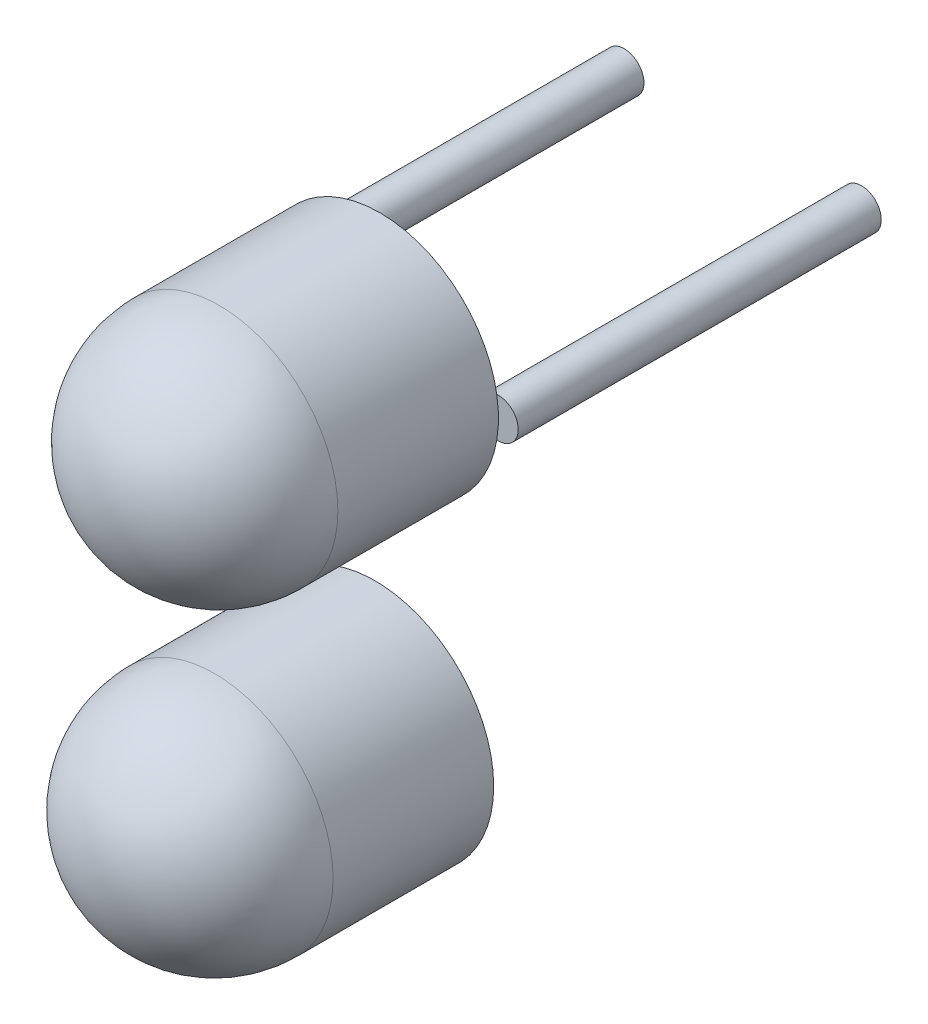
ISO-10303-21;
HEADER;
FILE_DESCRIPTION(('STEP AP214'),'2;1');
FILE_NAME('part.step','',(''),(''),'','','');
FILE_SCHEMA(('AUTOMOTIVE_DESIGN { 1 0 10303 214 1 1 1 1 }'));
ENDSEC;
DATA;
#1=APPLICATION_CONTEXT('core data for automotive mechanical design processes');
#2=APPLICATION_PROTOCOL_DEFINITION('international standard','automotive_design',2000,#1);
#3=PRODUCT_CONTEXT('',#1,'mechanical');
#4=PRODUCT('Part','Part','',(#3));
#5=PRODUCT_RELATED_PRODUCT_CATEGORY('part','',(#4));
#6=PRODUCT_DEFINITION_FORMATION('','',#4);
#7=PRODUCT_DEFINITION_CONTEXT('part definition',#1,'design');
#8=PRODUCT_DEFINITION('design','',#6,#7);
#9=PRODUCT_DEFINITION_SHAPE('','',#8);
#10=(LENGTH_UNIT() NAMED_UNIT(*) SI_UNIT(.MILLI.,.METRE.));
#11=(NAMED_UNIT(*) PLANE_ANGLE_UNIT() SI_UNIT($,.RADIAN.));
#12=(NAMED_UNIT(*) SI_UNIT($,.STERADIAN.) SOLID_ANGLE_UNIT());
#13=UNCERTAINTY_MEASURE_WITH_UNIT(LENGTH_MEASURE(1.E-05),#10,'distance_accuracy_value','');
#14=(GEOMETRIC_REPRESENTATION_CONTEXT(3) GLOBAL_UNCERTAINTY_ASSIGNED_CONTEXT((#13)) GLOBAL_UNIT_ASSIGNED_CONTEXT((#10,
#11,#12)) REPRESENTATION_CONTEXT('',''));
#15=CARTESIAN_POINT('',(0.,0.,0.));
#16=DIRECTION('',(0.,0.,1.));
#17=DIRECTION('',(1.,0.,0.));
#18=AXIS2_PLACEMENT_3D('',#15,#16,#17);
#19=CARTESIAN_POINT('',(-8.10999999999999,11.0000000000001,2.06000000000002));
#20=DIRECTION('',(0.,0.,1.));
#21=DIRECTION('',(0.,-1.,0.));
#22=AXIS2_PLACEMENT_3D('',#19,#20,#21);
#23=PLANE('',#22);
#24=CARTESIAN_POINT('',(5.32,8.99999999999999,2.06000000000002));
#25=DIRECTION('',(0.,0.,-1.));
#26=DIRECTION('',(0.,1.,0.));
#27=AXIS2_PLACEMENT_3D('',#24,#25,#26);
#28=CIRCLE('',#27,0.25);
#29=CARTESIAN_POINT('',(5.32,9.24999999999999,2.06000000000002));
#30=VERTEX_POINT('',#29);
#31=EDGE_CURVE('P0_E18',#30,#30,#28,.F.);
#32=ORIENTED_EDGE('',*,*,#31,.F.);
#33=EDGE_LOOP('',(#32));
#34=FACE_BOUND('',#33,.T.);
#35=ADVANCED_FACE('P0_F15',(#34),#23,.F.);
#36=CARTESIAN_POINT('',(3.82000000000003,13.,6.65000000000002));
#37=DIRECTION('',(0.,0.,-1.));
#38=DIRECTION('',(0.,1.,0.));
#39=AXIS2_PLACEMENT_3D('',#36,#37,#38);
#40=PLANE('',#39);
#41=CARTESIAN_POINT('',(5.32,8.99999999999999,6.65000000000001));
#42=DIRECTION('',(0.,0.,-1.));
#43=DIRECTION('',(0.,1.,0.));
#44=AXIS2_PLACEMENT_3D('',#41,#42,#43);
#45=CIRCLE('',#44,0.25);
#46=CARTESIAN_POINT('',(5.32,9.24999999999999,6.65000000000001));
#47=VERTEX_POINT('',#46);
#48=EDGE_CURVE('P0_E10',#47,#47,#45,.T.);
#49=ORIENTED_EDGE('',*,*,#48,.F.);
#50=EDGE_LOOP('',(#49));
#51=FACE_BOUND('',#50,.T.);
#52=ADVANCED_FACE('P0_F30',(#51),#40,.F.);
#53=CARTESIAN_POINT('',(5.32,8.99999999999999,6.65000000000001));
#54=DIRECTION('',(0.,0.,-1.));
#55=DIRECTION('',(0.,1.,0.));
#56=AXIS2_PLACEMENT_3D('',#53,#54,#55);
#57=CYLINDRICAL_SURFACE('',#56,0.25);
#58=ORIENTED_EDGE('',*,*,#31,.T.);
#59=EDGE_LOOP('',(#58));
#60=FACE_BOUND('',#59,.T.);
#61=ORIENTED_EDGE('',*,*,#48,.T.);
#62=EDGE_LOOP('',(#61));
#63=FACE_BOUND('',#62,.T.);
#64=ADVANCED_FACE('P0_F27',(#60,#63),#57,.T.);
#65=CLOSED_SHELL('',(#35,#52,#64));
#66=MANIFOLD_SOLID_BREP('P0_B1',#65);
#67=CARTESIAN_POINT('',(3.82,7.,6.71));
#68=DIRECTION('',(0.,0.,1.));
#69=DIRECTION('',(1.,0.,0.));
#70=AXIS2_PLACEMENT_3D('',#67,#68,#69);
#71=PLANE('',#70);
#72=CARTESIAN_POINT('',(3.82,5.,6.71));
#73=DIRECTION('',(0.,0.,1.));
#74=DIRECTION('',(1.,0.,0.));
#75=AXIS2_PLACEMENT_3D('',#72,#73,#74);
#76=CIRCLE('',#75,1.5);
#77=CARTESIAN_POINT('',(5.32,5.,6.71));
#78=VERTEX_POINT('',#77);
#79=EDGE_CURVE('P1_E20',#78,#78,#76,.T.);
#80=ORIENTED_EDGE('',*,*,#79,.F.);
#81=EDGE_LOOP('',(#80));
#82=FACE_BOUND('',#81,.T.);
#83=ADVANCED_FACE('P1_F17',(#82),#71,.F.);
#84=CARTESIAN_POINT('',(3.82,5.,8.74));
#85=DIRECTION('',(1.,0.,0.));
#86=DIRECTION('',(0.,-1.,0.));
#87=AXIS2_PLACEMENT_3D('',#84,#85,#86);
#88=SPHERICAL_SURFACE('',#87,1.5);
#89=CARTESIAN_POINT('',(3.82,5.,8.74));
#90=DIRECTION('',(0.,0.,1.));
#91=DIRECTION('',(1.,0.,0.));
#92=AXIS2_PLACEMENT_3D('',#89,#90,#91);
#93=CIRCLE('',#92,1.5);
#94=CARTESIAN_POINT('',(2.32,5.,8.74));
#95=VERTEX_POINT('',#94);
#96=CARTESIAN_POINT('',(5.32,5.,8.74));
#97=VERTEX_POINT('',#96);
#98=EDGE_CURVE('P1_E11',#95,#97,#93,.F.);
#99=ORIENTED_EDGE('',*,*,#98,.F.);
#100=CARTESIAN_POINT('',(3.82,5.,8.74));
#101=DIRECTION('',(0.,0.,1.));
#102=DIRECTION('',(1.,0.,0.));
#103=AXIS2_PLACEMENT_3D('',#100,#101,#102);
#104=CIRCLE('',#103,1.5);
#105=EDGE_CURVE('P1_E30',#97,#95,#104,.F.);
#106=ORIENTED_EDGE('',*,*,#105,.F.);
#107=EDGE_LOOP('',(#99,#106));
#108=FACE_BOUND('',#107,.T.);
#109=ADVANCED_FACE('P1_F33',(#108),#88,.T.);
#110=CARTESIAN_POINT('',(3.82,5.,8.2));
#111=DIRECTION('',(0.,0.,1.));
#112=DIRECTION('',(1.,0.,0.));
#113=AXIS2_PLACEMENT_3D('',#110,#111,#112);
#114=CYLINDRICAL_SURFACE('',#113,1.5);
#115=ORIENTED_EDGE('',*,*,#79,.T.);
#116=EDGE_LOOP('',(#115));
#117=FACE_BOUND('',#116,.T.);
#118=ORIENTED_EDGE('',*,*,#98,.T.);
#119=ORIENTED_EDGE('',*,*,#105,.T.);
#120=EDGE_LOOP('',(#118,#119));
#121=FACE_BOUND('',#120,.T.);
#122=ADVANCED_FACE('P1_F35',(#117,#121),#114,.T.);
#123=CLOSED_SHELL('',(#83,#109,#122));
#124=MANIFOLD_SOLID_BREP('P1_B1',#123);
#125=CARTESIAN_POINT('',(3.82,8.99999999999999,8.68000000000001));
#126=DIRECTION('',(-1.,0.,0.));
#127=DIRECTION('',(0.,1.,0.));
#128=AXIS2_PLACEMENT_3D('',#125,#126,#127);
#129=SPHERICAL_SURFACE('',#128,1.5);
#130=CARTESIAN_POINT('',(3.82,9.,8.68000000000001));
#131=DIRECTION('',(0.,0.,1.));
#132=DIRECTION('',(0.,-1.,0.));
#133=AXIS2_PLACEMENT_3D('',#130,#131,#132);
#134=CIRCLE('',#133,1.5);
#135=CARTESIAN_POINT('',(5.32,8.99999999999998,8.68000000000001));
#136=VERTEX_POINT('',#135);
#137=CARTESIAN_POINT('',(2.32,9.00000000000001,8.68000000000001));
#138=VERTEX_POINT('',#137);
#139=EDGE_CURVE('P2_E30',#136,#138,#134,.F.);
#140=ORIENTED_EDGE('',*,*,#139,.F.);
#141=CARTESIAN_POINT('',(3.82,9.,8.68000000000001));
#142=DIRECTION('',(0.,0.,1.));
#143=DIRECTION('',(0.,-1.,0.));
#144=AXIS2_PLACEMENT_3D('',#141,#142,#143);
#145=CIRCLE('',#144,1.5);
#146=EDGE_CURVE('P2_E24',#138,#136,#145,.F.);
#147=ORIENTED_EDGE('',*,*,#146,.F.);
#148=EDGE_LOOP('',(#140,#147));
#149=FACE_BOUND('',#148,.T.);
#150=ADVANCED_FACE('P2_F17',(#149),#129,.T.);
#151=CARTESIAN_POINT('',(3.82000000000001,11.,6.65000000000002));
#152=DIRECTION('',(0.,0.,1.));
#153=DIRECTION('',(0.,-1.,0.));
#154=AXIS2_PLACEMENT_3D('',#151,#152,#153);
#155=PLANE('',#154);
#156=CARTESIAN_POINT('',(3.82,9.,6.65000000000001));
#157=DIRECTION('',(0.,0.,1.));
#158=DIRECTION('',(0.,-1.,0.));
#159=AXIS2_PLACEMENT_3D('',#156,#157,#158);
#160=CIRCLE('',#159,1.5);
#161=CARTESIAN_POINT('',(3.82,7.5,6.65000000000001));
#162=VERTEX_POINT('',#161);
#163=EDGE_CURVE('P2_E11',#162,#162,#160,.T.);
#164=ORIENTED_EDGE('',*,*,#163,.F.);
#165=EDGE_LOOP('',(#164));
#166=FACE_BOUND('',#165,.T.);
#167=ADVANCED_FACE('P2_F43',(#166),#155,.F.);
#168=CARTESIAN_POINT('',(3.82,9.,8.14000000000001));
#169=DIRECTION('',(0.,0.,1.));
#170=DIRECTION('',(0.,-1.,0.));
#171=AXIS2_PLACEMENT_3D('',#168,#169,#170);
#172=CYLINDRICAL_SURFACE('',#171,1.5);
#173=ORIENTED_EDGE('',*,*,#139,.T.);
#174=ORIENTED_EDGE('',*,*,#146,.T.);
#175=EDGE_LOOP('',(#173,#174));
#176=FACE_BOUND('',#175,.T.);
#177=ORIENTED_EDGE('',*,*,#163,.T.);
#178=EDGE_LOOP('',(#177));
#179=FACE_BOUND('',#178,.T.);
#180=ADVANCED_FACE('P2_F33',(#176,#179),#172,.T.);
#181=CLOSED_SHELL('',(#150,#167,#180));
#182=MANIFOLD_SOLID_BREP('P2_B1',#181);
#183=CARTESIAN_POINT('',(-8.10999999999999,11.0000000000001,2.06000000000002));
#184=DIRECTION('',(0.,0.,1.));
#185=DIRECTION('',(0.,-1.,0.));
#186=AXIS2_PLACEMENT_3D('',#183,#184,#185);
#187=PLANE('',#186);
#188=CARTESIAN_POINT('',(2.32,9.00000000000001,2.06000000000002));
#189=DIRECTION('',(0.,0.,-1.));
#190=DIRECTION('',(0.,1.,0.));
#191=AXIS2_PLACEMENT_3D('',#188,#189,#190);
#192=CIRCLE('',#191,0.25);
#193=CARTESIAN_POINT('',(2.32,9.25000000000001,2.06000000000002));
#194=VERTEX_POINT('',#193);
#195=EDGE_CURVE('P3_E18',#194,#194,#192,.F.);
#196=ORIENTED_EDGE('',*,*,#195,.F.);
#197=EDGE_LOOP('',(#196));
#198=FACE_BOUND('',#197,.T.);
#199=ADVANCED_FACE('P3_F15',(#198),#187,.F.);
#200=CARTESIAN_POINT('',(3.82000000000003,13.,6.65000000000002));
#201=DIRECTION('',(0.,0.,-1.));
#202=DIRECTION('',(0.,1.,0.));
#203=AXIS2_PLACEMENT_3D('',#200,#201,#202);
#204=PLANE('',#203);
#205=CARTESIAN_POINT('',(2.32,9.00000000000001,6.65000000000001));
#206=DIRECTION('',(0.,0.,-1.));
#207=DIRECTION('',(0.,1.,0.));
#208=AXIS2_PLACEMENT_3D('',#205,#206,#207);
#209=CIRCLE('',#208,0.25);
#210=CARTESIAN_POINT('',(2.32,9.25000000000001,6.65000000000001));
#211=VERTEX_POINT('',#210);
#212=EDGE_CURVE('P3_E10',#211,#211,#209,.T.);
#213=ORIENTED_EDGE('',*,*,#212,.F.);
#214=EDGE_LOOP('',(#213));
#215=FACE_BOUND('',#214,.T.);
#216=ADVANCED_FACE('P3_F30',(#215),#204,.F.);
#217=CARTESIAN_POINT('',(2.32,9.00000000000001,6.65000000000001));
#218=DIRECTION('',(0.,0.,-1.));
#219=DIRECTION('',(0.,1.,0.));
#220=AXIS2_PLACEMENT_3D('',#217,#218,#219);
#221=CYLINDRICAL_SURFACE('',#220,0.25);
#222=ORIENTED_EDGE('',*,*,#195,.T.);
#223=EDGE_LOOP('',(#222));
#224=FACE_BOUND('',#223,.T.);
#225=ORIENTED_EDGE('',*,*,#212,.T.);
#226=EDGE_LOOP('',(#225));
#227=FACE_BOUND('',#226,.T.);
#228=ADVANCED_FACE('P3_F27',(#224,#227),#221,.T.);
#229=CLOSED_SHELL('',(#199,#216,#228));
#230=MANIFOLD_SOLID_BREP('P3_B1',#229);
#231=ADVANCED_BREP_SHAPE_REPRESENTATION('',(#18,#66,#124,#182,#230),#14);
#232=SHAPE_DEFINITION_REPRESENTATION(#9,#231);
ENDSEC;
END-ISO-10303-21;
